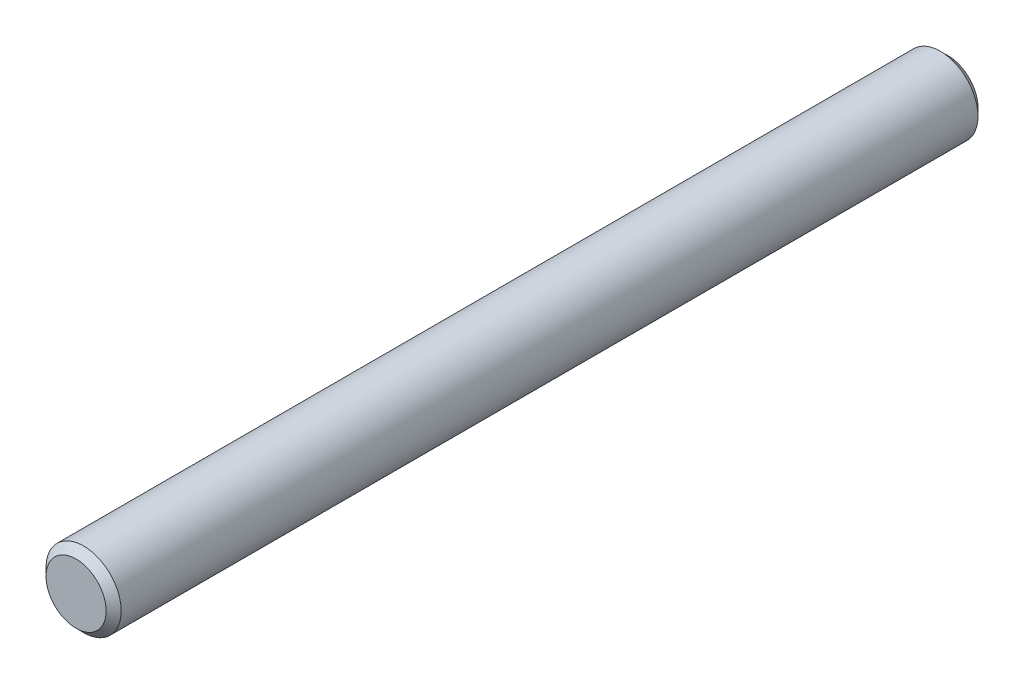
ISO-10303-21;
HEADER;
FILE_DESCRIPTION(('STEP AP214'),'2;1');
FILE_NAME('part.step','',(''),(''),'','','');
FILE_SCHEMA(('AUTOMOTIVE_DESIGN { 1 0 10303 214 1 1 1 1 }'));
ENDSEC;
DATA;
#1=APPLICATION_CONTEXT('core data for automotive mechanical design processes');
#2=APPLICATION_PROTOCOL_DEFINITION('international standard','automotive_design',2000,#1);
#3=PRODUCT_CONTEXT('',#1,'mechanical');
#4=PRODUCT('Part','Part','',(#3));
#5=PRODUCT_RELATED_PRODUCT_CATEGORY('part','',(#4));
#6=PRODUCT_DEFINITION_FORMATION('','',#4);
#7=PRODUCT_DEFINITION_CONTEXT('part definition',#1,'design');
#8=PRODUCT_DEFINITION('design','',#6,#7);
#9=PRODUCT_DEFINITION_SHAPE('','',#8);
#10=(LENGTH_UNIT() NAMED_UNIT(*) SI_UNIT(.MILLI.,.METRE.));
#11=(NAMED_UNIT(*) PLANE_ANGLE_UNIT() SI_UNIT($,.RADIAN.));
#12=(NAMED_UNIT(*) SI_UNIT($,.STERADIAN.) SOLID_ANGLE_UNIT());
#13=UNCERTAINTY_MEASURE_WITH_UNIT(LENGTH_MEASURE(1.E-05),#10,'distance_accuracy_value','');
#14=(GEOMETRIC_REPRESENTATION_CONTEXT(3) GLOBAL_UNCERTAINTY_ASSIGNED_CONTEXT((#13)) GLOBAL_UNIT_ASSIGNED_CONTEXT((#10,
#11,#12)) REPRESENTATION_CONTEXT('',''));
#15=CARTESIAN_POINT('',(0.,0.,0.));
#16=DIRECTION('',(0.,0.,1.));
#17=DIRECTION('',(1.,0.,0.));
#18=AXIS2_PLACEMENT_3D('',#15,#16,#17);
#19=CARTESIAN_POINT('',(0.,0.,-58.));
#20=DIRECTION('',(0.,0.,1.));
#21=DIRECTION('',(1.,0.,0.));
#22=AXIS2_PLACEMENT_3D('',#19,#20,#21);
#23=CYLINDRICAL_SURFACE('',#22,2.5);
#24=CARTESIAN_POINT('',(0.,0.,-57.5));
#25=DIRECTION('',(0.,0.,1.));
#26=DIRECTION('',(1.,0.,0.));
#27=AXIS2_PLACEMENT_3D('',#24,#25,#26);
#28=CIRCLE('',#27,2.5);
#29=CARTESIAN_POINT('',(2.5,0.,-57.5));
#30=VERTEX_POINT('',#29);
#31=EDGE_CURVE('E41',#30,#30,#28,.T.);
#32=CARTESIAN_POINT('',(0.,0.,-0.499999999999987));
#33=DIRECTION('',(0.,0.,1.));
#34=DIRECTION('',(1.,0.,0.));
#35=AXIS2_PLACEMENT_3D('',#32,#33,#34);
#36=CIRCLE('',#35,2.5);
#37=CARTESIAN_POINT('',(2.5,0.,-0.499999999999987));
#38=VERTEX_POINT('',#37);
#39=EDGE_CURVE('E45',#38,#38,#36,.F.);
#40=CARTESIAN_POINT('',(2.5,0.,-57.5));
#41=CARTESIAN_POINT('',(2.5,0.,-56.90625));
#42=CARTESIAN_POINT('',(2.5,0.,-56.3125));
#43=CARTESIAN_POINT('',(2.5,0.,-55.125));
#44=CARTESIAN_POINT('',(2.5,0.,-54.53125));
#45=CARTESIAN_POINT('',(2.5,0.,-53.34375));
#46=CARTESIAN_POINT('',(2.5,0.,-52.75));
#47=CARTESIAN_POINT('',(2.5,0.,-51.5625));
#48=CARTESIAN_POINT('',(2.5,0.,-50.96875));
#49=CARTESIAN_POINT('',(2.5,0.,-49.78125));
#50=CARTESIAN_POINT('',(2.5,0.,-49.1875));
#51=CARTESIAN_POINT('',(2.5,0.,-48.));
#52=CARTESIAN_POINT('',(2.5,0.,-47.40625));
#53=CARTESIAN_POINT('',(2.5,0.,-46.21875));
#54=CARTESIAN_POINT('',(2.5,0.,-45.625));
#55=CARTESIAN_POINT('',(2.5,0.,-44.4375));
#56=CARTESIAN_POINT('',(2.5,0.,-43.84375));
#57=CARTESIAN_POINT('',(2.5,0.,-42.65625));
#58=CARTESIAN_POINT('',(2.5,0.,-42.0625));
#59=CARTESIAN_POINT('',(2.5,0.,-40.875));
#60=CARTESIAN_POINT('',(2.5,0.,-40.28125));
#61=CARTESIAN_POINT('',(2.5,0.,-39.09375));
#62=CARTESIAN_POINT('',(2.5,0.,-38.5));
#63=CARTESIAN_POINT('',(2.5,0.,-37.3125));
#64=CARTESIAN_POINT('',(2.5,0.,-36.71875));
#65=CARTESIAN_POINT('',(2.5,0.,-35.53125));
#66=CARTESIAN_POINT('',(2.5,0.,-34.9375));
#67=CARTESIAN_POINT('',(2.5,0.,-33.75));
#68=CARTESIAN_POINT('',(2.5,0.,-33.15625));
#69=CARTESIAN_POINT('',(2.5,0.,-31.96875));
#70=CARTESIAN_POINT('',(2.5,0.,-31.375));
#71=CARTESIAN_POINT('',(2.5,0.,-30.1875));
#72=CARTESIAN_POINT('',(2.5,0.,-29.59375));
#73=CARTESIAN_POINT('',(2.5,0.,-28.40625));
#74=CARTESIAN_POINT('',(2.5,0.,-27.8125));
#75=CARTESIAN_POINT('',(2.5,0.,-26.625));
#76=CARTESIAN_POINT('',(2.5,0.,-26.03125));
#77=CARTESIAN_POINT('',(2.5,0.,-24.84375));
#78=CARTESIAN_POINT('',(2.5,0.,-24.25));
#79=CARTESIAN_POINT('',(2.5,0.,-23.0625));
#80=CARTESIAN_POINT('',(2.5,0.,-22.46875));
#81=CARTESIAN_POINT('',(2.5,0.,-21.28125));
#82=CARTESIAN_POINT('',(2.5,0.,-20.6875));
#83=CARTESIAN_POINT('',(2.5,0.,-19.5));
#84=CARTESIAN_POINT('',(2.5,0.,-18.90625));
#85=CARTESIAN_POINT('',(2.5,0.,-17.71875));
#86=CARTESIAN_POINT('',(2.5,0.,-17.125));
#87=CARTESIAN_POINT('',(2.5,0.,-15.9375));
#88=CARTESIAN_POINT('',(2.5,0.,-15.34375));
#89=CARTESIAN_POINT('',(2.5,0.,-14.15625));
#90=CARTESIAN_POINT('',(2.5,0.,-13.5625));
#91=CARTESIAN_POINT('',(2.5,0.,-12.375));
#92=CARTESIAN_POINT('',(2.5,0.,-11.78125));
#93=CARTESIAN_POINT('',(2.5,0.,-10.59375));
#94=CARTESIAN_POINT('',(2.5,0.,-9.99999999999998));
#95=CARTESIAN_POINT('',(2.5,0.,-8.81249999999999));
#96=CARTESIAN_POINT('',(2.5,0.,-8.21874999999998));
#97=CARTESIAN_POINT('',(2.5,0.,-7.03124999999999));
#98=CARTESIAN_POINT('',(2.5,0.,-6.43749999999999));
#99=CARTESIAN_POINT('',(2.5,0.,-5.24999999999999));
#100=CARTESIAN_POINT('',(2.5,0.,-4.65624999999998));
#101=CARTESIAN_POINT('',(2.5,0.,-3.46874999999998));
#102=CARTESIAN_POINT('',(2.5,0.,-2.87499999999998));
#103=CARTESIAN_POINT('',(2.5,0.,-1.68749999999999));
#104=CARTESIAN_POINT('',(2.5,0.,-1.09374999999999));
#105=CARTESIAN_POINT('',(2.5,0.,-0.499999999999987));
#106=B_SPLINE_CURVE_WITH_KNOTS('',3,(#40,#41,#42,#43,#44,#45,#46,#47,#48,#49,#50,#51,#52,#53,
#54,#55,#56,#57,#58,#59,#60,#61,#62,#63,#64,#65,#66,#67,#68,#69,#70,#71,#72,#73,#74,#75,#76,#77,
#78,#79,#80,#81,#82,#83,#84,#85,#86,#87,#88,#89,#90,#91,#92,#93,#94,#95,#96,#97,#98,#99,#100,
#101,#102,#103,#104,#105),.UNSPECIFIED.,.F.,.F.,(4,2,2,2,2,2,2,2,2,2,2,2,2,2,2,2,2,2,2,2,2,2,2,
2,2,2,2,2,2,2,2,2,4),(0.,1.78125,3.5625,5.34374999999999,7.12499999999999,8.90624999999999,
10.6875,12.46875,14.25,16.03125,17.8125,19.59375,21.375,23.15625,24.9375,26.71875,28.5,30.28125,
32.0625,33.84375,35.625,37.40625,39.1875,40.96875,42.75,44.53125,46.3125,48.09375,49.875,
51.65625,53.4375,55.21875,57.),.UNSPECIFIED.);
#107=EDGE_CURVE('BSEAM30',#30,#38,#106,.T.);
#108=ORIENTED_EDGE('',*,*,#31,.T.);
#109=ORIENTED_EDGE('',*,*,#39,.T.);
#110=ORIENTED_EDGE('',*,*,#107,.T.);
#111=ORIENTED_EDGE('',*,*,#107,.F.);
#112=EDGE_LOOP('',(#108,#110,#109,#111));
#113=FACE_BOUND('',#112,.T.);
#114=ADVANCED_FACE('F30',(#113),#23,.T.);
#115=CARTESIAN_POINT('',(0.,0.,-58.));
#116=DIRECTION('',(0.,0.,1.));
#117=DIRECTION('',(1.,0.,0.));
#118=AXIS2_PLACEMENT_3D('',#115,#116,#117);
#119=PLANE('',#118);
#120=CARTESIAN_POINT('',(0.,0.,-58.));
#121=DIRECTION('',(0.,0.,1.));
#122=DIRECTION('',(1.,0.,0.));
#123=AXIS2_PLACEMENT_3D('',#120,#121,#122);
#124=CIRCLE('',#123,1.99999999999997);
#125=CARTESIAN_POINT('',(1.99999999999997,0.,-58.));
#126=VERTEX_POINT('',#125);
#127=EDGE_CURVE('E37',#126,#126,#124,.F.);
#128=ORIENTED_EDGE('',*,*,#127,.T.);
#129=EDGE_LOOP('',(#128));
#130=FACE_BOUND('',#129,.T.);
#131=ADVANCED_FACE('F61',(#130),#119,.F.);
#132=CARTESIAN_POINT('',(0.,0.,0.));
#133=DIRECTION('',(0.,0.,1.));
#134=DIRECTION('',(1.,0.,0.));
#135=AXIS2_PLACEMENT_3D('',#132,#133,#134);
#136=PLANE('',#135);
#137=CARTESIAN_POINT('',(0.,0.,0.));
#138=DIRECTION('',(0.,0.,1.));
#139=DIRECTION('',(1.,0.,0.));
#140=AXIS2_PLACEMENT_3D('',#137,#138,#139);
#141=CIRCLE('',#140,2.00000000000001);
#142=CARTESIAN_POINT('',(2.00000000000001,0.,0.));
#143=VERTEX_POINT('',#142);
#144=EDGE_CURVE('E10',#143,#143,#141,.T.);
#145=ORIENTED_EDGE('',*,*,#144,.T.);
#146=EDGE_LOOP('',(#145));
#147=FACE_BOUND('',#146,.T.);
#148=ADVANCED_FACE('F58',(#147),#136,.T.);
#149=CARTESIAN_POINT('',(0.,0.,-57.5));
#150=DIRECTION('',(0.,0.,1.));
#151=DIRECTION('',(1.,0.,0.));
#152=AXIS2_PLACEMENT_3D('',#149,#150,#151);
#153=CONICAL_SURFACE('',#152,2.5,0.78539816339744);
#154=ORIENTED_EDGE('',*,*,#127,.F.);
#155=EDGE_LOOP('',(#154));
#156=FACE_BOUND('',#155,.T.);
#157=ORIENTED_EDGE('',*,*,#31,.F.);
#158=EDGE_LOOP('',(#157));
#159=FACE_BOUND('',#158,.T.);
#160=ADVANCED_FACE('F54',(#156,#159),#153,.T.);
#161=CARTESIAN_POINT('',(0.,0.,0.));
#162=DIRECTION('',(0.,0.,-1.));
#163=DIRECTION('',(-1.,0.,0.));
#164=AXIS2_PLACEMENT_3D('',#161,#162,#163);
#165=CONICAL_SURFACE('',#164,2.00000000000001,0.785398163397454);
#166=ORIENTED_EDGE('',*,*,#39,.F.);
#167=EDGE_LOOP('',(#166));
#168=FACE_BOUND('',#167,.T.);
#169=ORIENTED_EDGE('',*,*,#144,.F.);
#170=EDGE_LOOP('',(#169));
#171=FACE_BOUND('',#170,.T.);
#172=ADVANCED_FACE('F32',(#168,#171),#165,.T.);
#173=CLOSED_SHELL('',(#114,#131,#148,#160,#172));
#174=MANIFOLD_SOLID_BREP('B2',#173);
#175=ADVANCED_BREP_SHAPE_REPRESENTATION('',(#18,#174),#14);
#176=SHAPE_DEFINITION_REPRESENTATION(#9,#175);
ENDSEC;
END-ISO-10303-21;
